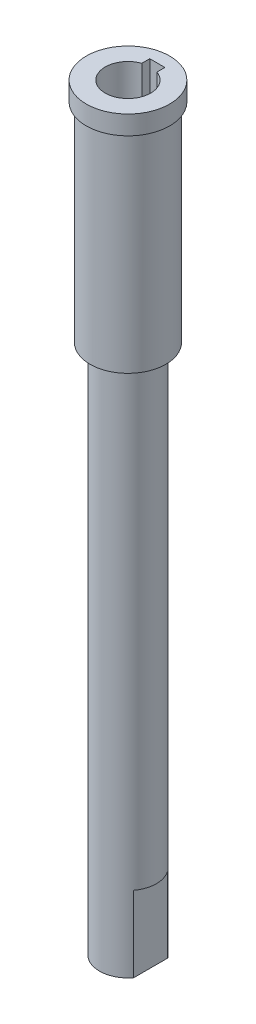
ISO-10303-21;
HEADER;
FILE_DESCRIPTION(('STEP AP214'),'2;1');
FILE_NAME('part.step','',(''),(''),'','','');
FILE_SCHEMA(('AUTOMOTIVE_DESIGN { 1 0 10303 214 1 1 1 1 }'));
ENDSEC;
DATA;
#1=APPLICATION_CONTEXT('core data for automotive mechanical design processes');
#2=APPLICATION_PROTOCOL_DEFINITION('international standard','automotive_design',2000,#1);
#3=PRODUCT_CONTEXT('',#1,'mechanical');
#4=PRODUCT('Part','Part','',(#3));
#5=PRODUCT_RELATED_PRODUCT_CATEGORY('part','',(#4));
#6=PRODUCT_DEFINITION_FORMATION('','',#4);
#7=PRODUCT_DEFINITION_CONTEXT('part definition',#1,'design');
#8=PRODUCT_DEFINITION('design','',#6,#7);
#9=PRODUCT_DEFINITION_SHAPE('','',#8);
#10=(LENGTH_UNIT() NAMED_UNIT(*) SI_UNIT(.MILLI.,.METRE.));
#11=(NAMED_UNIT(*) PLANE_ANGLE_UNIT() SI_UNIT($,.RADIAN.));
#12=(NAMED_UNIT(*) SI_UNIT($,.STERADIAN.) SOLID_ANGLE_UNIT());
#13=UNCERTAINTY_MEASURE_WITH_UNIT(LENGTH_MEASURE(1.E-05),#10,'distance_accuracy_value','');
#14=(GEOMETRIC_REPRESENTATION_CONTEXT(3) GLOBAL_UNCERTAINTY_ASSIGNED_CONTEXT((#13)) GLOBAL_UNIT_ASSIGNED_CONTEXT((#10,
#11,#12)) REPRESENTATION_CONTEXT('',''));
#15=CARTESIAN_POINT('',(0.,0.,0.));
#16=DIRECTION('',(0.,0.,1.));
#17=DIRECTION('',(1.,0.,0.));
#18=AXIS2_PLACEMENT_3D('',#15,#16,#17);
#19=CARTESIAN_POINT('',(0.,200.,0.));
#20=DIRECTION('',(0.,-1.,0.));
#21=DIRECTION('',(0.,0.,-1.));
#22=AXIS2_PLACEMENT_3D('',#19,#20,#21);
#23=CYLINDRICAL_SURFACE('',#22,10.);
#24=CARTESIAN_POINT('',(0.,140.,0.));
#25=DIRECTION('',(0.,-1.,0.));
#26=DIRECTION('',(0.,0.,-1.));
#27=AXIS2_PLACEMENT_3D('',#24,#25,#26);
#28=CIRCLE('',#27,10.);
#29=CARTESIAN_POINT('',(0.,140.,-10.));
#30=VERTEX_POINT('',#29);
#31=EDGE_CURVE('E105',#30,#30,#28,.T.);
#32=ORIENTED_EDGE('',*,*,#31,.F.);
#33=EDGE_LOOP('',(#32));
#34=FACE_BOUND('',#33,.T.);
#35=CARTESIAN_POINT('',(0.,195.,0.));
#36=DIRECTION('',(0.,1.,0.));
#37=DIRECTION('',(0.,0.,1.));
#38=AXIS2_PLACEMENT_3D('',#35,#36,#37);
#39=CIRCLE('',#38,10.);
#40=CARTESIAN_POINT('',(0.,195.,10.));
#41=VERTEX_POINT('',#40);
#42=EDGE_CURVE('E92',#41,#41,#39,.T.);
#43=ORIENTED_EDGE('',*,*,#42,.F.);
#44=EDGE_LOOP('',(#43));
#45=FACE_BOUND('',#44,.T.);
#46=ADVANCED_FACE('F36',(#34,#45),#23,.T.);
#47=CARTESIAN_POINT('',(0.,140.,0.));
#48=DIRECTION('',(0.,-1.,0.));
#49=DIRECTION('',(0.,0.,-1.));
#50=AXIS2_PLACEMENT_3D('',#47,#48,#49);
#51=PLANE('',#50);
#52=CARTESIAN_POINT('',(0.,140.,0.));
#53=DIRECTION('',(0.,-1.,0.));
#54=DIRECTION('',(0.,0.,-1.));
#55=AXIS2_PLACEMENT_3D('',#52,#53,#54);
#56=CIRCLE('',#55,7.5);
#57=CARTESIAN_POINT('',(0.,140.,-7.5));
#58=VERTEX_POINT('',#57);
#59=EDGE_CURVE('E101',#58,#58,#56,.T.);
#60=ORIENTED_EDGE('',*,*,#59,.F.);
#61=EDGE_LOOP('',(#60));
#62=FACE_BOUND('',#61,.T.);
#63=ORIENTED_EDGE('',*,*,#31,.T.);
#64=EDGE_LOOP('',(#63));
#65=FACE_BOUND('',#64,.T.);
#66=ADVANCED_FACE('F150',(#62,#65),#51,.T.);
#67=CARTESIAN_POINT('',(0.,140.,0.));
#68=DIRECTION('',(0.,-1.,0.));
#69=DIRECTION('',(0.,0.,-1.));
#70=AXIS2_PLACEMENT_3D('',#67,#68,#69);
#71=CYLINDRICAL_SURFACE('',#70,7.5);
#72=DIRECTION('',(0.,-1.,0.));
#73=VECTOR('',#72,1.);
#74=CARTESIAN_POINT('',(6.,140.,-4.5));
#75=LINE('',#74,#73);
#76=CARTESIAN_POINT('',(6.,0.,-4.5));
#77=VERTEX_POINT('',#76);
#78=CARTESIAN_POINT('',(6.,20.,-4.5));
#79=VERTEX_POINT('',#78);
#80=EDGE_CURVE('E87',#77,#79,#75,.F.);
#81=ORIENTED_EDGE('',*,*,#80,.F.);
#82=CARTESIAN_POINT('',(0.,0.,0.));
#83=DIRECTION('',(0.,-1.,0.));
#84=DIRECTION('',(0.,0.,-1.));
#85=AXIS2_PLACEMENT_3D('',#82,#83,#84);
#86=CIRCLE('',#85,7.5);
#87=CARTESIAN_POINT('',(6.,0.,4.5));
#88=VERTEX_POINT('',#87);
#89=EDGE_CURVE('E97',#88,#77,#86,.T.);
#90=ORIENTED_EDGE('',*,*,#89,.F.);
#91=DIRECTION('',(0.,-1.,0.));
#92=VECTOR('',#91,1.);
#93=CARTESIAN_POINT('',(6.,140.,4.5));
#94=LINE('',#93,#92);
#95=CARTESIAN_POINT('',(6.,20.,4.5));
#96=VERTEX_POINT('',#95);
#97=EDGE_CURVE('E50',#96,#88,#94,.T.);
#98=ORIENTED_EDGE('',*,*,#97,.F.);
#99=CARTESIAN_POINT('',(0.,20.,0.));
#100=DIRECTION('',(0.,1.,0.));
#101=DIRECTION('',(0.,0.,1.));
#102=AXIS2_PLACEMENT_3D('',#99,#100,#101);
#103=CIRCLE('',#102,7.5);
#104=EDGE_CURVE('E12',#79,#96,#103,.F.);
#105=ORIENTED_EDGE('',*,*,#104,.F.);
#106=EDGE_LOOP('',(#81,#90,#98,#105));
#107=FACE_BOUND('',#106,.T.);
#108=ORIENTED_EDGE('',*,*,#59,.T.);
#109=EDGE_LOOP('',(#108));
#110=FACE_BOUND('',#109,.T.);
#111=ADVANCED_FACE('F95',(#107,#110),#71,.T.);
#112=CARTESIAN_POINT('',(0.,0.,0.));
#113=DIRECTION('',(0.,1.,0.));
#114=DIRECTION('',(0.,0.,1.));
#115=AXIS2_PLACEMENT_3D('',#112,#113,#114);
#116=PLANE('',#115);
#117=ORIENTED_EDGE('',*,*,#89,.T.);
#118=DIRECTION('',(0.,0.,1.));
#119=VECTOR('',#118,1.);
#120=CARTESIAN_POINT('',(6.,0.,0.));
#121=LINE('',#120,#119);
#122=EDGE_CURVE('E43',#77,#88,#121,.T.);
#123=ORIENTED_EDGE('',*,*,#122,.T.);
#124=EDGE_LOOP('',(#117,#123));
#125=FACE_BOUND('',#124,.T.);
#126=ADVANCED_FACE('F100',(#125),#116,.F.);
#127=CARTESIAN_POINT('',(0.,195.,0.));
#128=DIRECTION('',(0.,1.,0.));
#129=DIRECTION('',(0.,0.,1.));
#130=AXIS2_PLACEMENT_3D('',#127,#128,#129);
#131=CYLINDRICAL_SURFACE('',#130,11.);
#132=CARTESIAN_POINT('',(0.,195.,0.));
#133=DIRECTION('',(0.,1.,0.));
#134=DIRECTION('',(0.,0.,1.));
#135=AXIS2_PLACEMENT_3D('',#132,#133,#134);
#136=CIRCLE('',#135,11.);
#137=CARTESIAN_POINT('',(0.,195.,11.));
#138=VERTEX_POINT('',#137);
#139=EDGE_CURVE('E102',#138,#138,#136,.T.);
#140=ORIENTED_EDGE('',*,*,#139,.T.);
#141=EDGE_LOOP('',(#140));
#142=FACE_BOUND('',#141,.T.);
#143=CARTESIAN_POINT('',(0.,200.,0.));
#144=DIRECTION('',(0.,1.,0.));
#145=DIRECTION('',(0.,0.,1.));
#146=AXIS2_PLACEMENT_3D('',#143,#144,#145);
#147=CIRCLE('',#146,11.);
#148=CARTESIAN_POINT('',(0.,200.,11.));
#149=VERTEX_POINT('',#148);
#150=EDGE_CURVE('E98',#149,#149,#147,.T.);
#151=ORIENTED_EDGE('',*,*,#150,.F.);
#152=EDGE_LOOP('',(#151));
#153=FACE_BOUND('',#152,.T.);
#154=ADVANCED_FACE('F189',(#142,#153),#131,.T.);
#155=CARTESIAN_POINT('',(0.,195.,0.));
#156=DIRECTION('',(0.,1.,0.));
#157=DIRECTION('',(0.,0.,1.));
#158=AXIS2_PLACEMENT_3D('',#155,#156,#157);
#159=PLANE('',#158);
#160=ORIENTED_EDGE('',*,*,#42,.T.);
#161=EDGE_LOOP('',(#160));
#162=FACE_BOUND('',#161,.T.);
#163=ORIENTED_EDGE('',*,*,#139,.F.);
#164=EDGE_LOOP('',(#163));
#165=FACE_BOUND('',#164,.T.);
#166=ADVANCED_FACE('F146',(#162,#165),#159,.F.);
#167=CARTESIAN_POINT('',(0.,170.,0.));
#168=DIRECTION('',(0.,1.,0.));
#169=DIRECTION('',(0.,0.,1.));
#170=AXIS2_PLACEMENT_3D('',#167,#168,#169);
#171=PLANE('',#170);
#172=DIRECTION('',(0.,0.,1.));
#173=VECTOR('',#172,1.);
#174=CARTESIAN_POINT('',(-2.,170.,-5.65685424949238));
#175=LINE('',#174,#173);
#176=CARTESIAN_POINT('',(-2.,170.,-7.74931739303482));
#177=VERTEX_POINT('',#176);
#178=CARTESIAN_POINT('',(-2.,170.,-5.65685424949238));
#179=VERTEX_POINT('',#178);
#180=EDGE_CURVE('E111',#177,#179,#175,.T.);
#181=ORIENTED_EDGE('',*,*,#180,.T.);
#182=CARTESIAN_POINT('',(0.,170.,0.));
#183=DIRECTION('',(0.,1.,0.));
#184=DIRECTION('',(0.,0.,1.));
#185=AXIS2_PLACEMENT_3D('',#182,#183,#184);
#186=CIRCLE('',#185,6.);
#187=CARTESIAN_POINT('',(2.,170.,-5.65685424949238));
#188=VERTEX_POINT('',#187);
#189=EDGE_CURVE('E114',#179,#188,#186,.T.);
#190=ORIENTED_EDGE('',*,*,#189,.T.);
#191=DIRECTION('',(0.,0.,-1.));
#192=VECTOR('',#191,1.);
#193=CARTESIAN_POINT('',(2.,170.,-5.65685424949238));
#194=LINE('',#193,#192);
#195=CARTESIAN_POINT('',(2.,170.,-7.74931739303482));
#196=VERTEX_POINT('',#195);
#197=EDGE_CURVE('E118',#188,#196,#194,.T.);
#198=ORIENTED_EDGE('',*,*,#197,.T.);
#199=DIRECTION('',(-1.,0.,0.));
#200=VECTOR('',#199,1.);
#201=CARTESIAN_POINT('',(2.,170.,-7.74931739303482));
#202=LINE('',#201,#200);
#203=EDGE_CURVE('E121',#196,#177,#202,.T.);
#204=ORIENTED_EDGE('',*,*,#203,.T.);
#205=EDGE_LOOP('',(#181,#190,#198,#204));
#206=FACE_BOUND('',#205,.T.);
#207=ADVANCED_FACE('F166',(#206),#171,.T.);
#208=CARTESIAN_POINT('',(0.,170.,0.));
#209=DIRECTION('',(0.,1.,0.));
#210=DIRECTION('',(0.,0.,1.));
#211=AXIS2_PLACEMENT_3D('',#208,#209,#210);
#212=CYLINDRICAL_SURFACE('',#211,6.);
#213=CARTESIAN_POINT('',(0.,200.,0.));
#214=DIRECTION('',(0.,1.,0.));
#215=DIRECTION('',(0.,0.,1.));
#216=AXIS2_PLACEMENT_3D('',#213,#214,#215);
#217=CIRCLE('',#216,6.);
#218=CARTESIAN_POINT('',(-2.,200.,-5.65685424949238));
#219=VERTEX_POINT('',#218);
#220=CARTESIAN_POINT('',(2.,200.,-5.65685424949238));
#221=VERTEX_POINT('',#220);
#222=EDGE_CURVE('E126',#219,#221,#217,.T.);
#223=ORIENTED_EDGE('',*,*,#222,.T.);
#224=DIRECTION('',(0.,1.,0.));
#225=VECTOR('',#224,1.);
#226=CARTESIAN_POINT('',(2.,170.,-5.65685424949238));
#227=LINE('',#226,#225);
#228=EDGE_CURVE('E138',#188,#221,#227,.T.);
#229=ORIENTED_EDGE('',*,*,#228,.F.);
#230=ORIENTED_EDGE('',*,*,#189,.F.);
#231=DIRECTION('',(0.,1.,0.));
#232=VECTOR('',#231,1.);
#233=CARTESIAN_POINT('',(-2.,170.,-5.65685424949238));
#234=LINE('',#233,#232);
#235=EDGE_CURVE('E124',#179,#219,#234,.T.);
#236=ORIENTED_EDGE('',*,*,#235,.T.);
#237=EDGE_LOOP('',(#223,#229,#230,#236));
#238=FACE_BOUND('',#237,.T.);
#239=ADVANCED_FACE('F169',(#238),#212,.F.);
#240=CARTESIAN_POINT('',(2.,170.,-5.65685424949238));
#241=DIRECTION('',(1.,0.,0.));
#242=DIRECTION('',(0.,0.,-1.));
#243=AXIS2_PLACEMENT_3D('',#240,#241,#242);
#244=PLANE('',#243);
#245=DIRECTION('',(0.,0.,-1.));
#246=VECTOR('',#245,1.);
#247=CARTESIAN_POINT('',(2.,200.,-5.65685424949238));
#248=LINE('',#247,#246);
#249=CARTESIAN_POINT('',(2.,200.,-7.74931739303482));
#250=VERTEX_POINT('',#249);
#251=EDGE_CURVE('E129',#221,#250,#248,.T.);
#252=ORIENTED_EDGE('',*,*,#251,.T.);
#253=DIRECTION('',(0.,1.,0.));
#254=VECTOR('',#253,1.);
#255=CARTESIAN_POINT('',(2.,170.,-7.74931739303482));
#256=LINE('',#255,#254);
#257=EDGE_CURVE('E136',#196,#250,#256,.T.);
#258=ORIENTED_EDGE('',*,*,#257,.F.);
#259=ORIENTED_EDGE('',*,*,#197,.F.);
#260=ORIENTED_EDGE('',*,*,#228,.T.);
#261=EDGE_LOOP('',(#252,#258,#259,#260));
#262=FACE_BOUND('',#261,.T.);
#263=ADVANCED_FACE('F175',(#262),#244,.F.);
#264=CARTESIAN_POINT('',(2.,170.,-7.74931739303482));
#265=DIRECTION('',(0.,0.,-1.));
#266=DIRECTION('',(-1.,0.,0.));
#267=AXIS2_PLACEMENT_3D('',#264,#265,#266);
#268=PLANE('',#267);
#269=DIRECTION('',(-1.,0.,0.));
#270=VECTOR('',#269,1.);
#271=CARTESIAN_POINT('',(2.,200.,-7.74931739303482));
#272=LINE('',#271,#270);
#273=CARTESIAN_POINT('',(-2.,200.,-7.74931739303482));
#274=VERTEX_POINT('',#273);
#275=EDGE_CURVE('E115',#250,#274,#272,.T.);
#276=ORIENTED_EDGE('',*,*,#275,.T.);
#277=DIRECTION('',(0.,1.,0.));
#278=VECTOR('',#277,1.);
#279=CARTESIAN_POINT('',(-2.,170.,-7.74931739303482));
#280=LINE('',#279,#278);
#281=EDGE_CURVE('E134',#177,#274,#280,.T.);
#282=ORIENTED_EDGE('',*,*,#281,.F.);
#283=ORIENTED_EDGE('',*,*,#203,.F.);
#284=ORIENTED_EDGE('',*,*,#257,.T.);
#285=EDGE_LOOP('',(#276,#282,#283,#284));
#286=FACE_BOUND('',#285,.T.);
#287=ADVANCED_FACE('F171',(#286),#268,.F.);
#288=CARTESIAN_POINT('',(-2.,170.,-5.65685424949238));
#289=DIRECTION('',(-1.,0.,0.));
#290=DIRECTION('',(0.,0.,1.));
#291=AXIS2_PLACEMENT_3D('',#288,#289,#290);
#292=PLANE('',#291);
#293=DIRECTION('',(0.,0.,1.));
#294=VECTOR('',#293,1.);
#295=CARTESIAN_POINT('',(-2.,200.,-5.65685424949238));
#296=LINE('',#295,#294);
#297=EDGE_CURVE('E58',#274,#219,#296,.T.);
#298=ORIENTED_EDGE('',*,*,#297,.T.);
#299=ORIENTED_EDGE('',*,*,#235,.F.);
#300=ORIENTED_EDGE('',*,*,#180,.F.);
#301=ORIENTED_EDGE('',*,*,#281,.T.);
#302=EDGE_LOOP('',(#298,#299,#300,#301));
#303=FACE_BOUND('',#302,.T.);
#304=ADVANCED_FACE('F174',(#303),#292,.F.);
#305=CARTESIAN_POINT('',(0.,200.,0.));
#306=DIRECTION('',(0.,1.,0.));
#307=DIRECTION('',(0.,0.,1.));
#308=AXIS2_PLACEMENT_3D('',#305,#306,#307);
#309=PLANE('',#308);
#310=ORIENTED_EDGE('',*,*,#297,.F.);
#311=ORIENTED_EDGE('',*,*,#275,.F.);
#312=ORIENTED_EDGE('',*,*,#251,.F.);
#313=ORIENTED_EDGE('',*,*,#222,.F.);
#314=EDGE_LOOP('',(#310,#311,#312,#313));
#315=FACE_BOUND('',#314,.T.);
#316=ORIENTED_EDGE('',*,*,#150,.T.);
#317=EDGE_LOOP('',(#316));
#318=FACE_BOUND('',#317,.T.);
#319=ADVANCED_FACE('F185',(#315,#318),#309,.T.);
#320=CARTESIAN_POINT('',(6.,20.,23.4714496267777));
#321=DIRECTION('',(-1.,0.,0.));
#322=DIRECTION('',(0.,0.,1.));
#323=AXIS2_PLACEMENT_3D('',#320,#321,#322);
#324=PLANE('',#323);
#325=ORIENTED_EDGE('',*,*,#80,.T.);
#326=DIRECTION('',(0.,0.,-1.));
#327=VECTOR('',#326,1.);
#328=CARTESIAN_POINT('',(6.,20.,23.4714496267777));
#329=LINE('',#328,#327);
#330=EDGE_CURVE('E207',#96,#79,#329,.T.);
#331=ORIENTED_EDGE('',*,*,#330,.F.);
#332=ORIENTED_EDGE('',*,*,#97,.T.);
#333=ORIENTED_EDGE('',*,*,#122,.F.);
#334=EDGE_LOOP('',(#325,#331,#332,#333));
#335=FACE_BOUND('',#334,.T.);
#336=ADVANCED_FACE('F86',(#335),#324,.F.);
#337=CARTESIAN_POINT('',(0.,20.,0.));
#338=DIRECTION('',(0.,1.,0.));
#339=DIRECTION('',(0.,0.,1.));
#340=AXIS2_PLACEMENT_3D('',#337,#338,#339);
#341=PLANE('',#340);
#342=ORIENTED_EDGE('',*,*,#104,.T.);
#343=ORIENTED_EDGE('',*,*,#330,.T.);
#344=EDGE_LOOP('',(#342,#343));
#345=FACE_BOUND('',#344,.T.);
#346=ADVANCED_FACE('F202',(#345),#341,.F.);
#347=CLOSED_SHELL('',(#46,#66,#111,#126,#154,#166,#207,#239,#263,#287,#304,#319,#336,#346));
#348=MANIFOLD_SOLID_BREP('B2',#347);
#349=ADVANCED_BREP_SHAPE_REPRESENTATION('',(#18,#348),#14);
#350=SHAPE_DEFINITION_REPRESENTATION(#9,#349);
ENDSEC;
END-ISO-10303-21;
